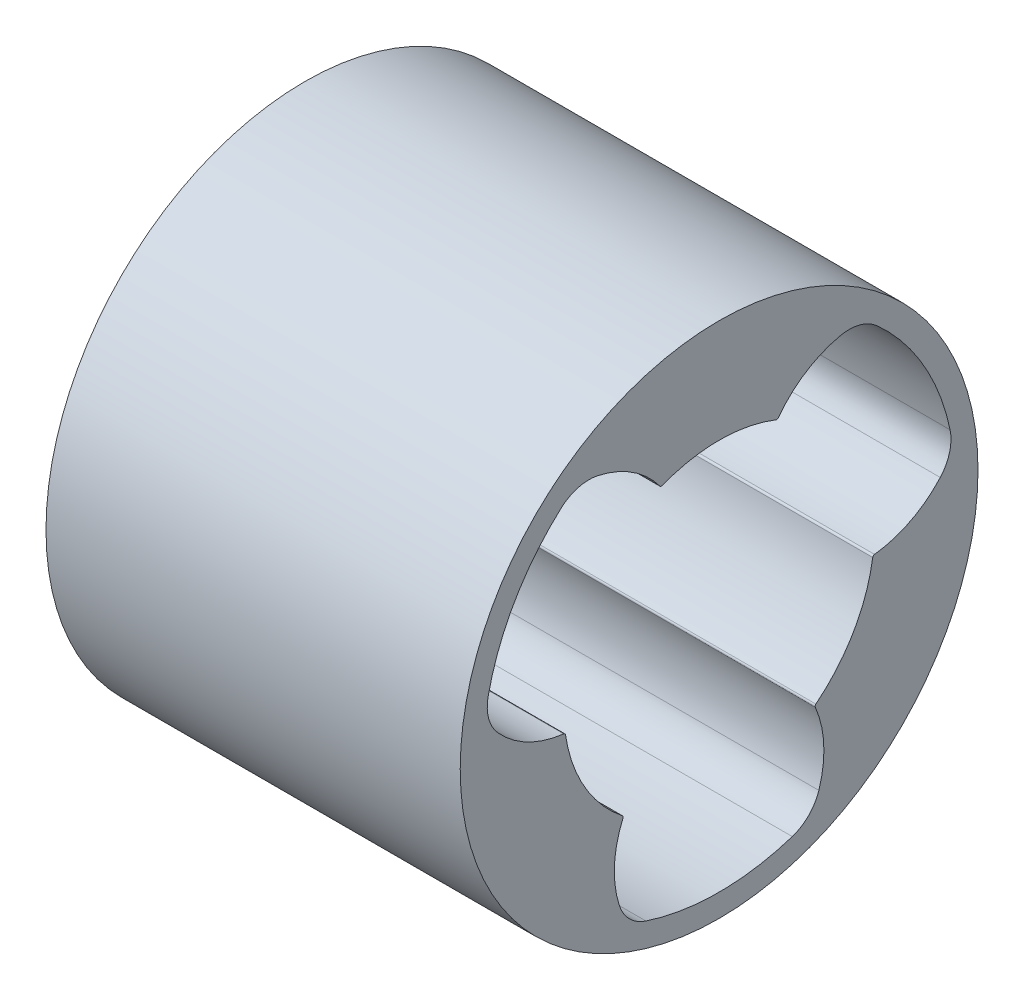
ISO-10303-21;
HEADER;
FILE_DESCRIPTION(('STEP AP214'),'2;1');
FILE_NAME('part.step','',(''),(''),'','','');
FILE_SCHEMA(('AUTOMOTIVE_DESIGN { 1 0 10303 214 1 1 1 1 }'));
ENDSEC;
DATA;
#1=APPLICATION_CONTEXT('core data for automotive mechanical design processes');
#2=APPLICATION_PROTOCOL_DEFINITION('international standard','automotive_design',2000,#1);
#3=PRODUCT_CONTEXT('',#1,'mechanical');
#4=PRODUCT('Part','Part','',(#3));
#5=PRODUCT_RELATED_PRODUCT_CATEGORY('part','',(#4));
#6=PRODUCT_DEFINITION_FORMATION('','',#4);
#7=PRODUCT_DEFINITION_CONTEXT('part definition',#1,'design');
#8=PRODUCT_DEFINITION('design','',#6,#7);
#9=PRODUCT_DEFINITION_SHAPE('','',#8);
#10=(LENGTH_UNIT() NAMED_UNIT(*) SI_UNIT(.MILLI.,.METRE.));
#11=(NAMED_UNIT(*) PLANE_ANGLE_UNIT() SI_UNIT($,.RADIAN.));
#12=(NAMED_UNIT(*) SI_UNIT($,.STERADIAN.) SOLID_ANGLE_UNIT());
#13=UNCERTAINTY_MEASURE_WITH_UNIT(LENGTH_MEASURE(1.E-05),#10,'distance_accuracy_value','');
#14=(GEOMETRIC_REPRESENTATION_CONTEXT(3) GLOBAL_UNCERTAINTY_ASSIGNED_CONTEXT((#13)) GLOBAL_UNIT_ASSIGNED_CONTEXT((#10,
#11,#12)) REPRESENTATION_CONTEXT('',''));
#15=CARTESIAN_POINT('',(0.,0.,0.));
#16=DIRECTION('',(0.,0.,1.));
#17=DIRECTION('',(1.,0.,0.));
#18=AXIS2_PLACEMENT_3D('',#15,#16,#17);
#19=CARTESIAN_POINT('',(7.62,10.16,17.5976362048998));
#20=DIRECTION('',(1.,0.,0.));
#21=DIRECTION('',(0.,0.,-1.));
#22=AXIS2_PLACEMENT_3D('',#19,#20,#21);
#23=CYLINDRICAL_SURFACE('',#22,12.8523999996979);
#24=CARTESIAN_POINT('',(7.62,10.16,17.5976362048998));
#25=DIRECTION('',(1.,0.,0.));
#26=DIRECTION('',(0.,0.,-1.));
#27=AXIS2_PLACEMENT_3D('',#24,#25,#26);
#28=CIRCLE('',#27,12.8523999996979);
#29=CARTESIAN_POINT('',(7.62,17.8124190998144,7.27171408273412));
#30=VERTEX_POINT('',#29);
#31=CARTESIAN_POINT('',(7.62,22.7238598368227,14.8895719972216));
#32=VERTEX_POINT('',#31);
#33=EDGE_CURVE('E245',#30,#32,#28,.T.);
#34=ORIENTED_EDGE('',*,*,#33,.F.);
#35=DIRECTION('',(1.,0.,0.));
#36=VECTOR('',#35,1.);
#37=CARTESIAN_POINT('',(7.62,17.8124190998144,7.27171408273412));
#38=LINE('',#37,#36);
#39=CARTESIAN_POINT('',(50.8,17.8124190998144,7.27171408273412));
#40=VERTEX_POINT('',#39);
#41=EDGE_CURVE('E337',#30,#40,#38,.T.);
#42=ORIENTED_EDGE('',*,*,#41,.T.);
#43=CARTESIAN_POINT('',(50.8,10.16,17.5976362048998));
#44=DIRECTION('',(1.,0.,0.));
#45=DIRECTION('',(0.,0.,-1.));
#46=AXIS2_PLACEMENT_3D('',#43,#44,#45);
#47=CIRCLE('',#46,12.8523999996979);
#48=CARTESIAN_POINT('',(50.8,22.7238598368227,14.8895719972216));
#49=VERTEX_POINT('',#48);
#50=EDGE_CURVE('E241',#40,#49,#47,.T.);
#51=ORIENTED_EDGE('',*,*,#50,.T.);
#52=DIRECTION('',(1.,0.,0.));
#53=VECTOR('',#52,1.);
#54=CARTESIAN_POINT('',(7.62,22.7238598368227,14.8895719972216));
#55=LINE('',#54,#53);
#56=EDGE_CURVE('E313',#49,#32,#55,.F.);
#57=ORIENTED_EDGE('',*,*,#56,.T.);
#58=EDGE_LOOP('',(#34,#42,#51,#57));
#59=FACE_BOUND('',#58,.T.);
#60=ADVANCED_FACE('F45',(#59),#23,.F.);
#61=CARTESIAN_POINT('',(7.62,-20.32,0.));
#62=DIRECTION('',(1.,0.,0.));
#63=DIRECTION('',(0.,0.,-1.));
#64=AXIS2_PLACEMENT_3D('',#61,#62,#63);
#65=CYLINDRICAL_SURFACE('',#64,12.8524);
#66=CARTESIAN_POINT('',(7.62,-20.32,0.));
#67=DIRECTION('',(1.,0.,0.));
#68=DIRECTION('',(0.,0.,-1.));
#69=AXIS2_PLACEMENT_3D('',#66,#67,#68);
#70=CIRCLE('',#69,12.8524);
#71=CARTESIAN_POINT('',(7.62,-15.2036986744186,11.7901504021727));
#72=VERTEX_POINT('',#71);
#73=CARTESIAN_POINT('',(7.62,-24.2566775196078,12.2346538923917));
#74=VERTEX_POINT('',#73);
#75=EDGE_CURVE('E564',#72,#74,#70,.T.);
#76=ORIENTED_EDGE('',*,*,#75,.F.);
#77=DIRECTION('',(1.,0.,0.));
#78=VECTOR('',#77,1.);
#79=CARTESIAN_POINT('',(7.62,-15.2036986744186,11.7901504021727));
#80=LINE('',#79,#78);
#81=CARTESIAN_POINT('',(50.8,-15.2036986744186,11.7901504021727));
#82=VERTEX_POINT('',#81);
#83=EDGE_CURVE('E387',#72,#82,#80,.T.);
#84=ORIENTED_EDGE('',*,*,#83,.T.);
#85=CARTESIAN_POINT('',(50.8,-20.32,0.));
#86=DIRECTION('',(1.,0.,0.));
#87=DIRECTION('',(0.,0.,-1.));
#88=AXIS2_PLACEMENT_3D('',#85,#86,#87);
#89=CIRCLE('',#88,12.8524);
#90=CARTESIAN_POINT('',(50.8,-24.2566775196078,12.2346538923917));
#91=VERTEX_POINT('',#90);
#92=EDGE_CURVE('E559',#82,#91,#89,.T.);
#93=ORIENTED_EDGE('',*,*,#92,.T.);
#94=DIRECTION('',(1.,0.,0.));
#95=VECTOR('',#94,1.);
#96=CARTESIAN_POINT('',(7.62,-24.2566775196078,12.2346538923917));
#97=LINE('',#96,#95);
#98=EDGE_CURVE('E292',#91,#74,#97,.F.);
#99=ORIENTED_EDGE('',*,*,#98,.T.);
#100=EDGE_LOOP('',(#76,#84,#93,#99));
#101=FACE_BOUND('',#100,.T.);
#102=ADVANCED_FACE('F454',(#101),#65,.F.);
#103=CARTESIAN_POINT('',(7.62,10.1600000003031,-17.597636204725));
#104=DIRECTION('',(1.,0.,0.));
#105=DIRECTION('',(0.,0.,-1.));
#106=AXIS2_PLACEMENT_3D('',#103,#104,#105);
#107=CYLINDRICAL_SURFACE('',#106,12.8523999996978);
#108=CARTESIAN_POINT('',(7.62,10.1600000003031,-17.597636204725));
#109=DIRECTION('',(1.,0.,0.));
#110=DIRECTION('',(0.,0.,-1.));
#111=AXIS2_PLACEMENT_3D('',#108,#109,#110);
#112=CIRCLE('',#111,12.8523999996978);
#113=CARTESIAN_POINT('',(7.62,-2.608720424874,-19.0618644847064));
#114=VERTEX_POINT('',#113);
#115=CARTESIAN_POINT('',(7.62,1.53281768342032,-27.1242258895754));
#116=VERTEX_POINT('',#115);
#117=EDGE_CURVE('E594',#114,#116,#112,.T.);
#118=ORIENTED_EDGE('',*,*,#117,.F.);
#119=DIRECTION('',(1.,0.,0.));
#120=VECTOR('',#119,1.);
#121=CARTESIAN_POINT('',(7.62,-2.60872042487401,-19.0618644847064));
#122=LINE('',#121,#120);
#123=CARTESIAN_POINT('',(50.8,-2.608720424874,-19.0618644847064));
#124=VERTEX_POINT('',#123);
#125=EDGE_CURVE('E379',#114,#124,#122,.T.);
#126=ORIENTED_EDGE('',*,*,#125,.T.);
#127=CARTESIAN_POINT('',(50.8,10.1600000003031,-17.597636204725));
#128=DIRECTION('',(1.,0.,0.));
#129=DIRECTION('',(0.,0.,-1.));
#130=AXIS2_PLACEMENT_3D('',#127,#128,#129);
#131=CIRCLE('',#130,12.8523999996978);
#132=CARTESIAN_POINT('',(50.8,1.53281768342032,-27.1242258895754));
#133=VERTEX_POINT('',#132);
#134=EDGE_CURVE('E589',#124,#133,#131,.T.);
#135=ORIENTED_EDGE('',*,*,#134,.T.);
#136=DIRECTION('',(1.,0.,0.));
#137=VECTOR('',#136,1.);
#138=CARTESIAN_POINT('',(7.62,1.53281768342032,-27.1242258895754));
#139=LINE('',#138,#137);
#140=EDGE_CURVE('E220',#133,#116,#139,.F.);
#141=ORIENTED_EDGE('',*,*,#140,.T.);
#142=EDGE_LOOP('',(#118,#126,#135,#141));
#143=FACE_BOUND('',#142,.T.);
#144=ADVANCED_FACE('F446',(#143),#107,.F.);
#145=CARTESIAN_POINT('',(50.8,0.,0.));
#146=DIRECTION('',(-1.,0.,0.));
#147=DIRECTION('',(0.,0.,1.));
#148=AXIS2_PLACEMENT_3D('',#145,#146,#147);
#149=CYLINDRICAL_SURFACE('',#148,31.75);
#150=CARTESIAN_POINT('',(50.8,0.,0.));
#151=DIRECTION('',(-1.,0.,0.));
#152=DIRECTION('',(0.,0.,1.));
#153=AXIS2_PLACEMENT_3D('',#150,#151,#152);
#154=CIRCLE('',#153,31.75);
#155=CARTESIAN_POINT('',(50.8,0.,31.75));
#156=VERTEX_POINT('',#155);
#157=EDGE_CURVE('E256',#156,#156,#154,.T.);
#158=ORIENTED_EDGE('',*,*,#157,.T.);
#159=EDGE_LOOP('',(#158));
#160=FACE_BOUND('',#159,.T.);
#161=CARTESIAN_POINT('',(0.,0.,0.));
#162=DIRECTION('',(-1.,0.,0.));
#163=DIRECTION('',(0.,0.,1.));
#164=AXIS2_PLACEMENT_3D('',#161,#162,#163);
#165=CIRCLE('',#164,31.75);
#166=CARTESIAN_POINT('',(0.,0.,31.75));
#167=VERTEX_POINT('',#166);
#168=EDGE_CURVE('E252',#167,#167,#165,.T.);
#169=ORIENTED_EDGE('',*,*,#168,.F.);
#170=EDGE_LOOP('',(#169));
#171=FACE_BOUND('',#170,.T.);
#172=ADVANCED_FACE('F444',(#160,#171),#149,.T.);
#173=CARTESIAN_POINT('',(50.8,31.75,0.));
#174=DIRECTION('',(1.,0.,0.));
#175=DIRECTION('',(0.,0.,-1.));
#176=AXIS2_PLACEMENT_3D('',#173,#174,#175);
#177=PLANE('',#176);
#178=ORIENTED_EDGE('',*,*,#50,.F.);
#179=CARTESIAN_POINT('',(50.8,17.9636526788657,7.0676444755719));
#180=DIRECTION('',(1.,0.,0.));
#181=DIRECTION('',(0.,0.,-1.));
#182=AXIS2_PLACEMENT_3D('',#179,#180,#181);
#183=CIRCLE('',#182,0.254000000000001);
#184=CARTESIAN_POINT('',(50.8,17.727288827828,6.9746491535249));
#185=VERTEX_POINT('',#184);
#186=EDGE_CURVE('E355',#40,#185,#183,.T.);
#187=ORIENTED_EDGE('',*,*,#186,.T.);
#188=CARTESIAN_POINT('',(50.8,0.,0.));
#189=DIRECTION('',(-1.,0.,0.));
#190=DIRECTION('',(0.,0.,1.));
#191=AXIS2_PLACEMENT_3D('',#188,#189,#190);
#192=CIRCLE('',#191,19.05);
#193=CARTESIAN_POINT('',(50.8,17.727288827948,-6.97464915321979));
#194=VERTEX_POINT('',#193);
#195=EDGE_CURVE('E423',#185,#194,#192,.T.);
#196=ORIENTED_EDGE('',*,*,#195,.T.);
#197=CARTESIAN_POINT('',(50.8,17.9636526789873,-7.06764447526272));
#198=DIRECTION('',(1.,0.,0.));
#199=DIRECTION('',(0.,0.,-1.));
#200=AXIS2_PLACEMENT_3D('',#197,#198,#199);
#201=CIRCLE('',#200,0.254000000000001);
#202=CARTESIAN_POINT('',(50.8,17.8124190999396,-7.27171408242754));
#203=VERTEX_POINT('',#202);
#204=EDGE_CURVE('E349',#194,#203,#201,.T.);
#205=ORIENTED_EDGE('',*,*,#204,.T.);
#206=CARTESIAN_POINT('',(50.8,22.7238598371625,-14.8895719972171));
#207=VERTEX_POINT('',#206);
#208=EDGE_CURVE('E583',#207,#203,#131,.T.);
#209=ORIENTED_EDGE('',*,*,#208,.F.);
#210=CARTESIAN_POINT('',(50.8,17.7579073323582,-15.9599531069292));
#211=DIRECTION('',(1.,0.,0.));
#212=DIRECTION('',(0.,0.,-1.));
#213=AXIS2_PLACEMENT_3D('',#210,#211,#212);
#214=CIRCLE('',#213,5.08);
#215=CARTESIAN_POINT('',(50.8,21.5361854881791,-19.3556878105312));
#216=VERTEX_POINT('',#215);
#217=EDGE_CURVE('E326',#207,#216,#214,.F.);
#218=ORIENTED_EDGE('',*,*,#217,.T.);
#219=CARTESIAN_POINT('',(50.8,0.,0.));
#220=DIRECTION('',(1.,0.,0.));
#221=DIRECTION('',(0.,0.,-1.));
#222=AXIS2_PLACEMENT_3D('',#219,#220,#221);
#223=CIRCLE('',#222,28.956);
#224=CARTESIAN_POINT('',(50.8,5.99442460852682,-28.328727638436));
#225=VERTEX_POINT('',#224);
#226=EDGE_CURVE('E588',#225,#216,#223,.T.);
#227=ORIENTED_EDGE('',*,*,#226,.F.);
#228=CARTESIAN_POINT('',(50.8,4.9427711684344,-23.3587754211665));
#229=DIRECTION('',(1.,0.,0.));
#230=DIRECTION('',(0.,0.,-1.));
#231=AXIS2_PLACEMENT_3D('',#228,#229,#230);
#232=CIRCLE('',#231,5.08);
#233=EDGE_CURVE('E333',#225,#133,#232,.F.);
#234=ORIENTED_EDGE('',*,*,#233,.T.);
#235=ORIENTED_EDGE('',*,*,#134,.F.);
#236=CARTESIAN_POINT('',(50.8,-2.86106667834194,-19.0908018024933));
#237=DIRECTION('',(1.,0.,0.));
#238=DIRECTION('',(0.,0.,-1.));
#239=AXIS2_PLACEMENT_3D('',#236,#237,#238);
#240=CIRCLE('',#239,0.254000000000001);
#241=CARTESIAN_POINT('',(50.8,-2.82342106415323,-18.8396070419342));
#242=VERTEX_POINT('',#241);
#243=EDGE_CURVE('E352',#124,#242,#240,.T.);
#244=ORIENTED_EDGE('',*,*,#243,.T.);
#245=CARTESIAN_POINT('',(50.8,0.,0.));
#246=DIRECTION('',(1.,0.,0.));
#247=DIRECTION('',(0.,0.,-1.));
#248=AXIS2_PLACEMENT_3D('',#245,#246,#247);
#249=CIRCLE('',#248,19.05);
#250=CARTESIAN_POINT('',(50.8,-14.9038677631579,-11.8649578886022));
#251=VERTEX_POINT('',#250);
#252=EDGE_CURVE('E231',#251,#242,#249,.T.);
#253=ORIENTED_EDGE('',*,*,#252,.F.);
#254=CARTESIAN_POINT('',(50.8,-15.102586,-12.0231573271169));
#255=DIRECTION('',(1.,0.,0.));
#256=DIRECTION('',(0.,0.,-1.));
#257=AXIS2_PLACEMENT_3D('',#254,#255,#256);
#258=CIRCLE('',#257,0.254000000000001);
#259=CARTESIAN_POINT('',(50.8,-15.2036986744186,-11.7901504021727));
#260=VERTEX_POINT('',#259);
#261=EDGE_CURVE('E341',#251,#260,#258,.T.);
#262=ORIENTED_EDGE('',*,*,#261,.T.);
#263=CARTESIAN_POINT('',(50.8,-24.2566775196078,-12.2346538923917));
#264=VERTEX_POINT('',#263);
#265=EDGE_CURVE('E553',#264,#260,#89,.T.);
#266=ORIENTED_EDGE('',*,*,#265,.F.);
#267=CARTESIAN_POINT('',(50.8,-22.7006785,-7.39882231437124));
#268=DIRECTION('',(1.,0.,0.));
#269=DIRECTION('',(0.,0.,-1.));
#270=AXIS2_PLACEMENT_3D('',#267,#268,#269);
#271=CIRCLE('',#270,5.08);
#272=CARTESIAN_POINT('',(50.8,-27.5306100957447,-8.97303982806725));
#273=VERTEX_POINT('',#272);
#274=EDGE_CURVE('E219',#264,#273,#271,.F.);
#275=ORIENTED_EDGE('',*,*,#274,.T.);
#276=CARTESIAN_POINT('',(50.8,-1.01518793371724E-13,0.));
#277=DIRECTION('',(1.,0.,0.));
#278=DIRECTION('',(0.,0.,-1.));
#279=AXIS2_PLACEMENT_3D('',#276,#277,#278);
#280=CIRCLE('',#279,28.9559999999999);
#281=CARTESIAN_POINT('',(50.8,-27.5306100957447,8.97303982806725));
#282=VERTEX_POINT('',#281);
#283=EDGE_CURVE('E558',#282,#273,#280,.T.);
#284=ORIENTED_EDGE('',*,*,#283,.F.);
#285=CARTESIAN_POINT('',(50.8,-22.7006785,7.39882231437124));
#286=DIRECTION('',(1.,0.,0.));
#287=DIRECTION('',(0.,0.,-1.));
#288=AXIS2_PLACEMENT_3D('',#285,#286,#287);
#289=CIRCLE('',#288,5.08);
#290=EDGE_CURVE('E322',#282,#91,#289,.F.);
#291=ORIENTED_EDGE('',*,*,#290,.T.);
#292=ORIENTED_EDGE('',*,*,#92,.F.);
#293=CARTESIAN_POINT('',(50.8,-15.102586,12.0231573271169));
#294=DIRECTION('',(1.,0.,0.));
#295=DIRECTION('',(0.,0.,-1.));
#296=AXIS2_PLACEMENT_3D('',#293,#294,#295);
#297=CIRCLE('',#296,0.254000000000001);
#298=CARTESIAN_POINT('',(50.8,-14.9038677631579,11.8649578886022));
#299=VERTEX_POINT('',#298);
#300=EDGE_CURVE('E346',#82,#299,#297,.T.);
#301=ORIENTED_EDGE('',*,*,#300,.T.);
#302=CARTESIAN_POINT('',(50.8,-2.82342106447779,18.8396070418855));
#303=VERTEX_POINT('',#302);
#304=EDGE_CURVE('E260',#299,#303,#192,.T.);
#305=ORIENTED_EDGE('',*,*,#304,.T.);
#306=CARTESIAN_POINT('',(50.8,-2.86106667867083,19.090801802444));
#307=DIRECTION('',(1.,0.,0.));
#308=DIRECTION('',(0.,0.,-1.));
#309=AXIS2_PLACEMENT_3D('',#306,#307,#308);
#310=CIRCLE('',#309,0.254000000000001);
#311=CARTESIAN_POINT('',(50.8,-2.6087204252024,19.0618644846615));
#312=VERTEX_POINT('',#311);
#313=EDGE_CURVE('E238',#303,#312,#310,.T.);
#314=ORIENTED_EDGE('',*,*,#313,.T.);
#315=CARTESIAN_POINT('',(50.8,1.53281768324661,27.1242258898675));
#316=VERTEX_POINT('',#315);
#317=EDGE_CURVE('E226',#316,#312,#47,.T.);
#318=ORIENTED_EDGE('',*,*,#317,.F.);
#319=CARTESIAN_POINT('',(50.8,4.94277116820953,23.3587754214123));
#320=DIRECTION('',(1.,0.,0.));
#321=DIRECTION('',(0.,0.,-1.));
#322=AXIS2_PLACEMENT_3D('',#319,#320,#321);
#323=CIRCLE('',#322,5.08);
#324=CARTESIAN_POINT('',(50.8,5.99442460836939,28.3287276386675));
#325=VERTEX_POINT('',#324);
#326=EDGE_CURVE('E208',#316,#325,#323,.F.);
#327=ORIENTED_EDGE('',*,*,#326,.T.);
#328=CARTESIAN_POINT('',(50.8,-5.41826999933548E-10,3.12860848339369E-10));
#329=DIRECTION('',(1.,0.,0.));
#330=DIRECTION('',(0.,0.,-1.));
#331=AXIS2_PLACEMENT_3D('',#328,#329,#330);
#332=CIRCLE('',#331,28.956);
#333=CARTESIAN_POINT('',(50.8,21.5361854879,19.3556878105517));
#334=VERTEX_POINT('',#333);
#335=EDGE_CURVE('E240',#334,#325,#332,.T.);
#336=ORIENTED_EDGE('',*,*,#335,.F.);
#337=CARTESIAN_POINT('',(50.8,17.757907332033,15.959953107001));
#338=DIRECTION('',(1.,0.,0.));
#339=DIRECTION('',(0.,0.,-1.));
#340=AXIS2_PLACEMENT_3D('',#337,#338,#339);
#341=CIRCLE('',#340,5.08);
#342=EDGE_CURVE('E329',#334,#49,#341,.F.);
#343=ORIENTED_EDGE('',*,*,#342,.T.);
#344=EDGE_LOOP('',(#178,#187,#196,#205,#209,#218,#227,#234,#235,#244,#253,#262,#266,#275,#284,
#291,#292,#301,#305,#314,#318,#327,#336,#343));
#345=FACE_BOUND('',#344,.T.);
#346=ORIENTED_EDGE('',*,*,#157,.F.);
#347=EDGE_LOOP('',(#346));
#348=FACE_BOUND('',#347,.T.);
#349=ADVANCED_FACE('F234',(#345,#348),#177,.T.);
#350=CARTESIAN_POINT('',(0.,0.,0.));
#351=DIRECTION('',(-1.,0.,0.));
#352=DIRECTION('',(0.,0.,1.));
#353=AXIS2_PLACEMENT_3D('',#350,#351,#352);
#354=PLANE('',#353);
#355=CARTESIAN_POINT('',(0.,0.,0.));
#356=DIRECTION('',(-1.,0.,0.));
#357=DIRECTION('',(0.,0.,1.));
#358=AXIS2_PLACEMENT_3D('',#355,#356,#357);
#359=CIRCLE('',#358,19.05);
#360=CARTESIAN_POINT('',(0.,0.,19.05));
#361=VERTEX_POINT('',#360);
#362=EDGE_CURVE('E429',#361,#361,#359,.T.);
#363=ORIENTED_EDGE('',*,*,#362,.F.);
#364=EDGE_LOOP('',(#363));
#365=FACE_BOUND('',#364,.T.);
#366=ORIENTED_EDGE('',*,*,#168,.T.);
#367=EDGE_LOOP('',(#366));
#368=FACE_BOUND('',#367,.T.);
#369=ADVANCED_FACE('F438',(#365,#368),#354,.T.);
#370=ORIENTED_EDGE('',*,*,#317,.T.);
#371=DIRECTION('',(1.,0.,0.));
#372=VECTOR('',#371,1.);
#373=CARTESIAN_POINT('',(7.62,-2.6087204252024,19.0618644846615));
#374=LINE('',#373,#372);
#375=CARTESIAN_POINT('',(7.62,-2.6087204252024,19.0618644846615));
#376=VERTEX_POINT('',#375);
#377=EDGE_CURVE('E391',#312,#376,#374,.F.);
#378=ORIENTED_EDGE('',*,*,#377,.T.);
#379=CARTESIAN_POINT('',(7.62,1.53281768324661,27.1242258898675));
#380=VERTEX_POINT('',#379);
#381=EDGE_CURVE('E228',#380,#376,#28,.T.);
#382=ORIENTED_EDGE('',*,*,#381,.F.);
#383=DIRECTION('',(1.,0.,0.));
#384=VECTOR('',#383,1.);
#385=CARTESIAN_POINT('',(7.62,1.53281768324661,27.1242258898675));
#386=LINE('',#385,#384);
#387=EDGE_CURVE('E212',#380,#316,#386,.T.);
#388=ORIENTED_EDGE('',*,*,#387,.T.);
#389=EDGE_LOOP('',(#370,#378,#382,#388));
#390=FACE_BOUND('',#389,.T.);
#391=ADVANCED_FACE('F225',(#390),#23,.F.);
#392=CARTESIAN_POINT('',(7.62,-5.41826999933548E-10,3.12860848339369E-10));
#393=DIRECTION('',(1.,0.,0.));
#394=DIRECTION('',(0.,0.,-1.));
#395=AXIS2_PLACEMENT_3D('',#392,#393,#394);
#396=CYLINDRICAL_SURFACE('',#395,28.956);
#397=ORIENTED_EDGE('',*,*,#335,.T.);
#398=DIRECTION('',(1.,0.,0.));
#399=VECTOR('',#398,1.);
#400=CARTESIAN_POINT('',(7.62,5.99442460836939,28.3287276386675));
#401=LINE('',#400,#399);
#402=CARTESIAN_POINT('',(7.62,5.99442460836939,28.3287276386675));
#403=VERTEX_POINT('',#402);
#404=EDGE_CURVE('E213',#325,#403,#401,.F.);
#405=ORIENTED_EDGE('',*,*,#404,.T.);
#406=CARTESIAN_POINT('',(7.62,-5.41826999933548E-10,3.12860848339369E-10));
#407=DIRECTION('',(1.,0.,0.));
#408=DIRECTION('',(0.,0.,-1.));
#409=AXIS2_PLACEMENT_3D('',#406,#407,#408);
#410=CIRCLE('',#409,28.956);
#411=CARTESIAN_POINT('',(7.62,21.5361854879,19.3556878105517));
#412=VERTEX_POINT('',#411);
#413=EDGE_CURVE('E249',#412,#403,#410,.T.);
#414=ORIENTED_EDGE('',*,*,#413,.F.);
#415=DIRECTION('',(1.,0.,0.));
#416=VECTOR('',#415,1.);
#417=CARTESIAN_POINT('',(7.62,21.5361854879,19.3556878105517));
#418=LINE('',#417,#416);
#419=EDGE_CURVE('E230',#412,#334,#418,.T.);
#420=ORIENTED_EDGE('',*,*,#419,.T.);
#421=EDGE_LOOP('',(#397,#405,#414,#420));
#422=FACE_BOUND('',#421,.T.);
#423=ADVANCED_FACE('F472',(#422),#396,.F.);
#424=CARTESIAN_POINT('',(7.62,5.07999999972909,8.79881810260633));
#425=DIRECTION('',(1.,0.,0.));
#426=DIRECTION('',(0.,0.,-1.));
#427=AXIS2_PLACEMENT_3D('',#424,#425,#426);
#428=PLANE('',#427);
#429=ORIENTED_EDGE('',*,*,#413,.T.);
#430=CARTESIAN_POINT('',(7.62,4.94277116820953,23.3587754214123));
#431=DIRECTION('',(1.,0.,0.));
#432=DIRECTION('',(0.,0.,-1.));
#433=AXIS2_PLACEMENT_3D('',#430,#431,#432);
#434=CIRCLE('',#433,5.08);
#435=EDGE_CURVE('E272',#403,#380,#434,.T.);
#436=ORIENTED_EDGE('',*,*,#435,.T.);
#437=ORIENTED_EDGE('',*,*,#381,.T.);
#438=CARTESIAN_POINT('',(7.62,-2.86106667867083,19.090801802444));
#439=DIRECTION('',(1.,0.,0.));
#440=DIRECTION('',(0.,0.,-1.));
#441=AXIS2_PLACEMENT_3D('',#438,#439,#440);
#442=CIRCLE('',#441,0.254000000000001);
#443=CARTESIAN_POINT('',(7.62,-2.82342106447779,18.8396070418855));
#444=VERTEX_POINT('',#443);
#445=EDGE_CURVE('E54',#376,#444,#442,.F.);
#446=ORIENTED_EDGE('',*,*,#445,.T.);
#447=CARTESIAN_POINT('',(7.62,0.,0.));
#448=DIRECTION('',(1.,0.,0.));
#449=DIRECTION('',(0.,0.,-1.));
#450=AXIS2_PLACEMENT_3D('',#447,#448,#449);
#451=CIRCLE('',#450,19.05);
#452=CARTESIAN_POINT('',(7.62,17.727288827828,6.9746491535249));
#453=VERTEX_POINT('',#452);
#454=EDGE_CURVE('E413',#453,#444,#451,.T.);
#455=ORIENTED_EDGE('',*,*,#454,.F.);
#456=CARTESIAN_POINT('',(7.62,17.9636526788657,7.0676444755719));
#457=DIRECTION('',(1.,0.,0.));
#458=DIRECTION('',(0.,0.,-1.));
#459=AXIS2_PLACEMENT_3D('',#456,#457,#458);
#460=CIRCLE('',#459,0.254000000000001);
#461=EDGE_CURVE('E397',#453,#30,#460,.F.);
#462=ORIENTED_EDGE('',*,*,#461,.T.);
#463=ORIENTED_EDGE('',*,*,#33,.T.);
#464=CARTESIAN_POINT('',(7.62,17.757907332033,15.959953107001));
#465=DIRECTION('',(1.,0.,0.));
#466=DIRECTION('',(0.,0.,-1.));
#467=AXIS2_PLACEMENT_3D('',#464,#465,#466);
#468=CIRCLE('',#467,5.08);
#469=EDGE_CURVE('E269',#32,#412,#468,.T.);
#470=ORIENTED_EDGE('',*,*,#469,.T.);
#471=EDGE_LOOP('',(#429,#436,#437,#446,#455,#462,#463,#470));
#472=FACE_BOUND('',#471,.T.);
#473=ADVANCED_FACE('F412',(#472),#428,.T.);
#474=ORIENTED_EDGE('',*,*,#265,.T.);
#475=DIRECTION('',(1.,0.,0.));
#476=VECTOR('',#475,1.);
#477=CARTESIAN_POINT('',(7.62,-15.2036986744186,-11.7901504021727));
#478=LINE('',#477,#476);
#479=CARTESIAN_POINT('',(7.62,-15.2036986744186,-11.7901504021727));
#480=VERTEX_POINT('',#479);
#481=EDGE_CURVE('E394',#260,#480,#478,.F.);
#482=ORIENTED_EDGE('',*,*,#481,.T.);
#483=CARTESIAN_POINT('',(7.62,-24.2566775196078,-12.2346538923917));
#484=VERTEX_POINT('',#483);
#485=EDGE_CURVE('E598',#484,#480,#70,.T.);
#486=ORIENTED_EDGE('',*,*,#485,.F.);
#487=DIRECTION('',(1.,0.,0.));
#488=VECTOR('',#487,1.);
#489=CARTESIAN_POINT('',(7.62,-24.2566775196078,-12.2346538923917));
#490=LINE('',#489,#488);
#491=EDGE_CURVE('E275',#484,#264,#490,.T.);
#492=ORIENTED_EDGE('',*,*,#491,.T.);
#493=EDGE_LOOP('',(#474,#482,#486,#492));
#494=FACE_BOUND('',#493,.T.);
#495=ADVANCED_FACE('F468',(#494),#65,.F.);
#496=CARTESIAN_POINT('',(7.62,-1.01518793371724E-13,0.));
#497=DIRECTION('',(1.,0.,0.));
#498=DIRECTION('',(0.,0.,-1.));
#499=AXIS2_PLACEMENT_3D('',#496,#497,#498);
#500=CYLINDRICAL_SURFACE('',#499,28.9559999999999);
#501=ORIENTED_EDGE('',*,*,#283,.T.);
#502=DIRECTION('',(1.,0.,0.));
#503=VECTOR('',#502,1.);
#504=CARTESIAN_POINT('',(7.62,-27.5306100957447,-8.97303982806725));
#505=LINE('',#504,#503);
#506=CARTESIAN_POINT('',(7.62,-27.5306100957447,-8.97303982806725));
#507=VERTEX_POINT('',#506);
#508=EDGE_CURVE('E283',#273,#507,#505,.F.);
#509=ORIENTED_EDGE('',*,*,#508,.T.);
#510=CARTESIAN_POINT('',(7.62,-1.01518793371724E-13,0.));
#511=DIRECTION('',(1.,0.,0.));
#512=DIRECTION('',(0.,0.,-1.));
#513=AXIS2_PLACEMENT_3D('',#510,#511,#512);
#514=CIRCLE('',#513,28.9559999999999);
#515=CARTESIAN_POINT('',(7.62,-27.5306100957447,8.97303982806725));
#516=VERTEX_POINT('',#515);
#517=EDGE_CURVE('E247',#516,#507,#514,.T.);
#518=ORIENTED_EDGE('',*,*,#517,.F.);
#519=DIRECTION('',(1.,0.,0.));
#520=VECTOR('',#519,1.);
#521=CARTESIAN_POINT('',(7.62,-27.5306100957447,8.97303982806725));
#522=LINE('',#521,#520);
#523=EDGE_CURVE('E279',#516,#282,#522,.T.);
#524=ORIENTED_EDGE('',*,*,#523,.T.);
#525=EDGE_LOOP('',(#501,#509,#518,#524));
#526=FACE_BOUND('',#525,.T.);
#527=ADVANCED_FACE('F484',(#526),#500,.F.);
#528=CARTESIAN_POINT('',(7.62,-10.1600000000001,0.));
#529=DIRECTION('',(1.,0.,0.));
#530=DIRECTION('',(0.,0.,-1.));
#531=AXIS2_PLACEMENT_3D('',#528,#529,#530);
#532=PLANE('',#531);
#533=ORIENTED_EDGE('',*,*,#517,.T.);
#534=CARTESIAN_POINT('',(7.62,-22.7006785,-7.39882231437124));
#535=DIRECTION('',(1.,0.,0.));
#536=DIRECTION('',(0.,0.,-1.));
#537=AXIS2_PLACEMENT_3D('',#534,#535,#536);
#538=CIRCLE('',#537,5.08);
#539=EDGE_CURVE('E289',#507,#484,#538,.T.);
#540=ORIENTED_EDGE('',*,*,#539,.T.);
#541=ORIENTED_EDGE('',*,*,#485,.T.);
#542=CARTESIAN_POINT('',(7.62,-15.102586,-12.0231573271169));
#543=DIRECTION('',(1.,0.,0.));
#544=DIRECTION('',(0.,0.,-1.));
#545=AXIS2_PLACEMENT_3D('',#542,#543,#544);
#546=CIRCLE('',#545,0.254000000000001);
#547=CARTESIAN_POINT('',(7.62,-14.9038677631579,-11.8649578886022));
#548=VERTEX_POINT('',#547);
#549=EDGE_CURVE('E11',#480,#548,#546,.F.);
#550=ORIENTED_EDGE('',*,*,#549,.T.);
#551=CARTESIAN_POINT('',(7.62,0.,0.));
#552=DIRECTION('',(1.,0.,0.));
#553=DIRECTION('',(0.,0.,-1.));
#554=AXIS2_PLACEMENT_3D('',#551,#552,#553);
#555=CIRCLE('',#554,19.05);
#556=CARTESIAN_POINT('',(7.62,-14.9038677631579,11.8649578886022));
#557=VERTEX_POINT('',#556);
#558=EDGE_CURVE('E433',#557,#548,#555,.T.);
#559=ORIENTED_EDGE('',*,*,#558,.F.);
#560=CARTESIAN_POINT('',(7.62,-15.102586,12.0231573271169));
#561=DIRECTION('',(1.,0.,0.));
#562=DIRECTION('',(0.,0.,-1.));
#563=AXIS2_PLACEMENT_3D('',#560,#561,#562);
#564=CIRCLE('',#563,0.254000000000001);
#565=EDGE_CURVE('E407',#557,#72,#564,.F.);
#566=ORIENTED_EDGE('',*,*,#565,.T.);
#567=ORIENTED_EDGE('',*,*,#75,.T.);
#568=CARTESIAN_POINT('',(7.62,-22.7006785,7.39882231437124));
#569=DIRECTION('',(1.,0.,0.));
#570=DIRECTION('',(0.,0.,-1.));
#571=AXIS2_PLACEMENT_3D('',#568,#569,#570);
#572=CIRCLE('',#571,5.08);
#573=EDGE_CURVE('E286',#74,#516,#572,.T.);
#574=ORIENTED_EDGE('',*,*,#573,.T.);
#575=EDGE_LOOP('',(#533,#540,#541,#550,#559,#566,#567,#574));
#576=FACE_BOUND('',#575,.T.);
#577=ADVANCED_FACE('F487',(#576),#532,.T.);
#578=ORIENTED_EDGE('',*,*,#208,.T.);
#579=DIRECTION('',(1.,0.,0.));
#580=VECTOR('',#579,1.);
#581=CARTESIAN_POINT('',(7.62,17.8124190999396,-7.27171408242754));
#582=LINE('',#581,#580);
#583=CARTESIAN_POINT('',(7.62,17.8124190999396,-7.27171408242754));
#584=VERTEX_POINT('',#583);
#585=EDGE_CURVE('E383',#203,#584,#582,.F.);
#586=ORIENTED_EDGE('',*,*,#585,.T.);
#587=CARTESIAN_POINT('',(7.62,22.7238598371625,-14.8895719972171));
#588=VERTEX_POINT('',#587);
#589=EDGE_CURVE('E617',#588,#584,#112,.T.);
#590=ORIENTED_EDGE('',*,*,#589,.F.);
#591=DIRECTION('',(1.,0.,0.));
#592=VECTOR('',#591,1.);
#593=CARTESIAN_POINT('',(7.62,22.7238598371625,-14.8895719972171));
#594=LINE('',#593,#592);
#595=EDGE_CURVE('E296',#588,#207,#594,.T.);
#596=ORIENTED_EDGE('',*,*,#595,.T.);
#597=EDGE_LOOP('',(#578,#586,#590,#596));
#598=FACE_BOUND('',#597,.T.);
#599=ADVANCED_FACE('F457',(#598),#107,.F.);
#600=CARTESIAN_POINT('',(7.62,0.,0.));
#601=DIRECTION('',(1.,0.,0.));
#602=DIRECTION('',(0.,0.,-1.));
#603=AXIS2_PLACEMENT_3D('',#600,#601,#602);
#604=CYLINDRICAL_SURFACE('',#603,28.956);
#605=ORIENTED_EDGE('',*,*,#226,.T.);
#606=DIRECTION('',(1.,0.,0.));
#607=VECTOR('',#606,1.);
#608=CARTESIAN_POINT('',(7.62,21.5361854881791,-19.3556878105312));
#609=LINE('',#608,#607);
#610=CARTESIAN_POINT('',(7.62,21.5361854881791,-19.3556878105312));
#611=VERTEX_POINT('',#610);
#612=EDGE_CURVE('E304',#216,#611,#609,.F.);
#613=ORIENTED_EDGE('',*,*,#612,.T.);
#614=CARTESIAN_POINT('',(7.62,0.,0.));
#615=DIRECTION('',(1.,0.,0.));
#616=DIRECTION('',(0.,0.,-1.));
#617=AXIS2_PLACEMENT_3D('',#614,#615,#616);
#618=CIRCLE('',#617,28.956);
#619=CARTESIAN_POINT('',(7.62,5.99442460852682,-28.328727638436));
#620=VERTEX_POINT('',#619);
#621=EDGE_CURVE('E566',#620,#611,#618,.T.);
#622=ORIENTED_EDGE('',*,*,#621,.F.);
#623=DIRECTION('',(1.,0.,0.));
#624=VECTOR('',#623,1.);
#625=CARTESIAN_POINT('',(7.62,5.99442460852682,-28.328727638436));
#626=LINE('',#625,#624);
#627=EDGE_CURVE('E300',#620,#225,#626,.T.);
#628=ORIENTED_EDGE('',*,*,#627,.T.);
#629=EDGE_LOOP('',(#605,#613,#622,#628));
#630=FACE_BOUND('',#629,.T.);
#631=ADVANCED_FACE('F493',(#630),#604,.F.);
#632=CARTESIAN_POINT('',(7.62,5.08000000015157,-8.79881810236249));
#633=DIRECTION('',(1.,0.,0.));
#634=DIRECTION('',(0.,0.,-1.));
#635=AXIS2_PLACEMENT_3D('',#632,#633,#634);
#636=PLANE('',#635);
#637=ORIENTED_EDGE('',*,*,#621,.T.);
#638=CARTESIAN_POINT('',(7.62,17.7579073323582,-15.9599531069292));
#639=DIRECTION('',(1.,0.,0.));
#640=DIRECTION('',(0.,0.,-1.));
#641=AXIS2_PLACEMENT_3D('',#638,#639,#640);
#642=CIRCLE('',#641,5.08);
#643=EDGE_CURVE('E310',#611,#588,#642,.T.);
#644=ORIENTED_EDGE('',*,*,#643,.T.);
#645=ORIENTED_EDGE('',*,*,#589,.T.);
#646=CARTESIAN_POINT('',(7.62,17.9636526789873,-7.06764447526272));
#647=DIRECTION('',(1.,0.,0.));
#648=DIRECTION('',(0.,0.,-1.));
#649=AXIS2_PLACEMENT_3D('',#646,#647,#648);
#650=CIRCLE('',#649,0.254000000000001);
#651=CARTESIAN_POINT('',(7.62,17.727288827948,-6.97464915321979));
#652=VERTEX_POINT('',#651);
#653=EDGE_CURVE('E403',#584,#652,#650,.F.);
#654=ORIENTED_EDGE('',*,*,#653,.T.);
#655=CARTESIAN_POINT('',(7.62,0.,0.));
#656=DIRECTION('',(1.,0.,0.));
#657=DIRECTION('',(0.,0.,-1.));
#658=AXIS2_PLACEMENT_3D('',#655,#656,#657);
#659=CIRCLE('',#658,19.05);
#660=CARTESIAN_POINT('',(7.62,-2.82342106415323,-18.8396070419342));
#661=VERTEX_POINT('',#660);
#662=EDGE_CURVE('E428',#661,#652,#659,.T.);
#663=ORIENTED_EDGE('',*,*,#662,.F.);
#664=CARTESIAN_POINT('',(7.62,-2.86106667834194,-19.0908018024933));
#665=DIRECTION('',(1.,0.,0.));
#666=DIRECTION('',(0.,0.,-1.));
#667=AXIS2_PLACEMENT_3D('',#664,#665,#666);
#668=CIRCLE('',#667,0.254000000000001);
#669=EDGE_CURVE('E400',#661,#114,#668,.F.);
#670=ORIENTED_EDGE('',*,*,#669,.T.);
#671=ORIENTED_EDGE('',*,*,#117,.T.);
#672=CARTESIAN_POINT('',(7.62,4.9427711684344,-23.3587754211665));
#673=DIRECTION('',(1.,0.,0.));
#674=DIRECTION('',(0.,0.,-1.));
#675=AXIS2_PLACEMENT_3D('',#672,#673,#674);
#676=CIRCLE('',#675,5.08);
#677=EDGE_CURVE('E307',#116,#620,#676,.T.);
#678=ORIENTED_EDGE('',*,*,#677,.T.);
#679=EDGE_LOOP('',(#637,#644,#645,#654,#663,#670,#671,#678));
#680=FACE_BOUND('',#679,.T.);
#681=ADVANCED_FACE('F497',(#680),#636,.T.);
#682=CARTESIAN_POINT('',(0.,0.,0.));
#683=DIRECTION('',(-1.,0.,0.));
#684=DIRECTION('',(0.,0.,1.));
#685=AXIS2_PLACEMENT_3D('',#682,#683,#684);
#686=CYLINDRICAL_SURFACE('',#685,19.05);
#687=ORIENTED_EDGE('',*,*,#362,.T.);
#688=EDGE_LOOP('',(#687));
#689=FACE_BOUND('',#688,.T.);
#690=ORIENTED_EDGE('',*,*,#195,.F.);
#691=DIRECTION('',(-1.,0.,0.));
#692=VECTOR('',#691,1.);
#693=CARTESIAN_POINT('',(0.,17.727288827828,6.9746491535249));
#694=LINE('',#693,#692);
#695=EDGE_CURVE('E375',#185,#453,#694,.T.);
#696=ORIENTED_EDGE('',*,*,#695,.T.);
#697=ORIENTED_EDGE('',*,*,#454,.T.);
#698=DIRECTION('',(-1.,0.,0.));
#699=VECTOR('',#698,1.);
#700=CARTESIAN_POINT('',(0.,-2.82342106447779,18.8396070418855));
#701=LINE('',#700,#699);
#702=EDGE_CURVE('E361',#444,#303,#701,.F.);
#703=ORIENTED_EDGE('',*,*,#702,.T.);
#704=ORIENTED_EDGE('',*,*,#304,.F.);
#705=DIRECTION('',(-1.,0.,0.));
#706=VECTOR('',#705,1.);
#707=CARTESIAN_POINT('',(0.,-14.9038677631579,11.8649578886022));
#708=LINE('',#707,#706);
#709=EDGE_CURVE('E364',#299,#557,#708,.T.);
#710=ORIENTED_EDGE('',*,*,#709,.T.);
#711=ORIENTED_EDGE('',*,*,#558,.T.);
#712=DIRECTION('',(-1.,0.,0.));
#713=VECTOR('',#712,1.);
#714=CARTESIAN_POINT('',(0.,-14.9038677631579,-11.8649578886022));
#715=LINE('',#714,#713);
#716=EDGE_CURVE('E358',#548,#251,#715,.F.);
#717=ORIENTED_EDGE('',*,*,#716,.T.);
#718=ORIENTED_EDGE('',*,*,#252,.T.);
#719=DIRECTION('',(-1.,0.,0.));
#720=VECTOR('',#719,1.);
#721=CARTESIAN_POINT('',(0.,-2.82342106415323,-18.8396070419342));
#722=LINE('',#721,#720);
#723=EDGE_CURVE('E371',#242,#661,#722,.T.);
#724=ORIENTED_EDGE('',*,*,#723,.T.);
#725=ORIENTED_EDGE('',*,*,#662,.T.);
#726=DIRECTION('',(-1.,0.,0.));
#727=VECTOR('',#726,1.);
#728=CARTESIAN_POINT('',(0.,17.727288827948,-6.97464915321979));
#729=LINE('',#728,#727);
#730=EDGE_CURVE('E368',#652,#194,#729,.F.);
#731=ORIENTED_EDGE('',*,*,#730,.T.);
#732=EDGE_LOOP('',(#690,#696,#697,#703,#704,#710,#711,#717,#718,#724,#725,#731));
#733=FACE_BOUND('',#732,.T.);
#734=ADVANCED_FACE('F418',(#689,#733),#686,.F.);
#735=CARTESIAN_POINT('',(7.62,4.94277116820953,23.3587754214123));
#736=DIRECTION('',(-1.,0.,0.));
#737=DIRECTION('',(0.,0.,1.));
#738=AXIS2_PLACEMENT_3D('',#735,#736,#737);
#739=CYLINDRICAL_SURFACE('',#738,5.08);
#740=ORIENTED_EDGE('',*,*,#435,.F.);
#741=ORIENTED_EDGE('',*,*,#404,.F.);
#742=ORIENTED_EDGE('',*,*,#326,.F.);
#743=ORIENTED_EDGE('',*,*,#387,.F.);
#744=EDGE_LOOP('',(#740,#741,#742,#743));
#745=FACE_BOUND('',#744,.T.);
#746=ADVANCED_FACE('F211',(#745),#739,.F.);
#747=CARTESIAN_POINT('',(7.62,-22.7006785,-7.39882231437124));
#748=DIRECTION('',(-1.,0.,0.));
#749=DIRECTION('',(0.,0.,1.));
#750=AXIS2_PLACEMENT_3D('',#747,#748,#749);
#751=CYLINDRICAL_SURFACE('',#750,5.08);
#752=ORIENTED_EDGE('',*,*,#539,.F.);
#753=ORIENTED_EDGE('',*,*,#508,.F.);
#754=ORIENTED_EDGE('',*,*,#274,.F.);
#755=ORIENTED_EDGE('',*,*,#491,.F.);
#756=EDGE_LOOP('',(#752,#753,#754,#755));
#757=FACE_BOUND('',#756,.T.);
#758=ADVANCED_FACE('F507',(#757),#751,.F.);
#759=CARTESIAN_POINT('',(7.62,-22.7006785,7.39882231437124));
#760=DIRECTION('',(-1.,0.,0.));
#761=DIRECTION('',(0.,0.,1.));
#762=AXIS2_PLACEMENT_3D('',#759,#760,#761);
#763=CYLINDRICAL_SURFACE('',#762,5.08);
#764=ORIENTED_EDGE('',*,*,#573,.F.);
#765=ORIENTED_EDGE('',*,*,#98,.F.);
#766=ORIENTED_EDGE('',*,*,#290,.F.);
#767=ORIENTED_EDGE('',*,*,#523,.F.);
#768=EDGE_LOOP('',(#764,#765,#766,#767));
#769=FACE_BOUND('',#768,.T.);
#770=ADVANCED_FACE('F511',(#769),#763,.F.);
#771=CARTESIAN_POINT('',(7.62,17.7579073323582,-15.9599531069292));
#772=DIRECTION('',(-1.,0.,0.));
#773=DIRECTION('',(0.,0.,1.));
#774=AXIS2_PLACEMENT_3D('',#771,#772,#773);
#775=CYLINDRICAL_SURFACE('',#774,5.08);
#776=ORIENTED_EDGE('',*,*,#643,.F.);
#777=ORIENTED_EDGE('',*,*,#612,.F.);
#778=ORIENTED_EDGE('',*,*,#217,.F.);
#779=ORIENTED_EDGE('',*,*,#595,.F.);
#780=EDGE_LOOP('',(#776,#777,#778,#779));
#781=FACE_BOUND('',#780,.T.);
#782=ADVANCED_FACE('F517',(#781),#775,.F.);
#783=CARTESIAN_POINT('',(7.62,17.757907332033,15.959953107001));
#784=DIRECTION('',(-1.,0.,0.));
#785=DIRECTION('',(0.,0.,1.));
#786=AXIS2_PLACEMENT_3D('',#783,#784,#785);
#787=CYLINDRICAL_SURFACE('',#786,5.08);
#788=ORIENTED_EDGE('',*,*,#469,.F.);
#789=ORIENTED_EDGE('',*,*,#56,.F.);
#790=ORIENTED_EDGE('',*,*,#342,.F.);
#791=ORIENTED_EDGE('',*,*,#419,.F.);
#792=EDGE_LOOP('',(#788,#789,#790,#791));
#793=FACE_BOUND('',#792,.T.);
#794=ADVANCED_FACE('F521',(#793),#787,.F.);
#795=CARTESIAN_POINT('',(7.62,4.9427711684344,-23.3587754211665));
#796=DIRECTION('',(-1.,0.,0.));
#797=DIRECTION('',(0.,0.,1.));
#798=AXIS2_PLACEMENT_3D('',#795,#796,#797);
#799=CYLINDRICAL_SURFACE('',#798,5.08);
#800=ORIENTED_EDGE('',*,*,#677,.F.);
#801=ORIENTED_EDGE('',*,*,#140,.F.);
#802=ORIENTED_EDGE('',*,*,#233,.F.);
#803=ORIENTED_EDGE('',*,*,#627,.F.);
#804=EDGE_LOOP('',(#800,#801,#802,#803));
#805=FACE_BOUND('',#804,.T.);
#806=ADVANCED_FACE('F525',(#805),#799,.F.);
#807=CARTESIAN_POINT('',(0.,17.9636526788657,7.0676444755719));
#808=DIRECTION('',(1.,0.,0.));
#809=DIRECTION('',(0.,0.,-1.));
#810=AXIS2_PLACEMENT_3D('',#807,#808,#809);
#811=CYLINDRICAL_SURFACE('',#810,0.254000000000001);
#812=ORIENTED_EDGE('',*,*,#461,.F.);
#813=ORIENTED_EDGE('',*,*,#695,.F.);
#814=ORIENTED_EDGE('',*,*,#186,.F.);
#815=ORIENTED_EDGE('',*,*,#41,.F.);
#816=EDGE_LOOP('',(#812,#813,#814,#815));
#817=FACE_BOUND('',#816,.T.);
#818=ADVANCED_FACE('F528',(#817),#811,.T.);
#819=CARTESIAN_POINT('',(0.,-2.86106667834194,-19.0908018024933));
#820=DIRECTION('',(1.,0.,0.));
#821=DIRECTION('',(0.,0.,-1.));
#822=AXIS2_PLACEMENT_3D('',#819,#820,#821);
#823=CYLINDRICAL_SURFACE('',#822,0.254000000000001);
#824=ORIENTED_EDGE('',*,*,#669,.F.);
#825=ORIENTED_EDGE('',*,*,#723,.F.);
#826=ORIENTED_EDGE('',*,*,#243,.F.);
#827=ORIENTED_EDGE('',*,*,#125,.F.);
#828=EDGE_LOOP('',(#824,#825,#826,#827));
#829=FACE_BOUND('',#828,.T.);
#830=ADVANCED_FACE('F531',(#829),#823,.T.);
#831=CARTESIAN_POINT('',(0.,17.9636526789873,-7.06764447526272));
#832=DIRECTION('',(-1.,0.,0.));
#833=DIRECTION('',(0.,0.,1.));
#834=AXIS2_PLACEMENT_3D('',#831,#832,#833);
#835=CYLINDRICAL_SURFACE('',#834,0.254000000000001);
#836=ORIENTED_EDGE('',*,*,#204,.F.);
#837=ORIENTED_EDGE('',*,*,#730,.F.);
#838=ORIENTED_EDGE('',*,*,#653,.F.);
#839=ORIENTED_EDGE('',*,*,#585,.F.);
#840=EDGE_LOOP('',(#836,#837,#838,#839));
#841=FACE_BOUND('',#840,.T.);
#842=ADVANCED_FACE('F535',(#841),#835,.T.);
#843=CARTESIAN_POINT('',(0.,-15.102586,12.0231573271169));
#844=DIRECTION('',(1.,0.,0.));
#845=DIRECTION('',(0.,0.,-1.));
#846=AXIS2_PLACEMENT_3D('',#843,#844,#845);
#847=CYLINDRICAL_SURFACE('',#846,0.254000000000001);
#848=ORIENTED_EDGE('',*,*,#565,.F.);
#849=ORIENTED_EDGE('',*,*,#709,.F.);
#850=ORIENTED_EDGE('',*,*,#300,.F.);
#851=ORIENTED_EDGE('',*,*,#83,.F.);
#852=EDGE_LOOP('',(#848,#849,#850,#851));
#853=FACE_BOUND('',#852,.T.);
#854=ADVANCED_FACE('F539',(#853),#847,.T.);
#855=CARTESIAN_POINT('',(0.,-2.86106667867083,19.090801802444));
#856=DIRECTION('',(-1.,0.,0.));
#857=DIRECTION('',(0.,0.,1.));
#858=AXIS2_PLACEMENT_3D('',#855,#856,#857);
#859=CYLINDRICAL_SURFACE('',#858,0.254000000000001);
#860=ORIENTED_EDGE('',*,*,#313,.F.);
#861=ORIENTED_EDGE('',*,*,#702,.F.);
#862=ORIENTED_EDGE('',*,*,#445,.F.);
#863=ORIENTED_EDGE('',*,*,#377,.F.);
#864=EDGE_LOOP('',(#860,#861,#862,#863));
#865=FACE_BOUND('',#864,.T.);
#866=ADVANCED_FACE('F414',(#865),#859,.T.);
#867=CARTESIAN_POINT('',(0.,-15.102586,-12.0231573271169));
#868=DIRECTION('',(-1.,0.,0.));
#869=DIRECTION('',(0.,0.,1.));
#870=AXIS2_PLACEMENT_3D('',#867,#868,#869);
#871=CYLINDRICAL_SURFACE('',#870,0.254000000000001);
#872=ORIENTED_EDGE('',*,*,#261,.F.);
#873=ORIENTED_EDGE('',*,*,#716,.F.);
#874=ORIENTED_EDGE('',*,*,#549,.F.);
#875=ORIENTED_EDGE('',*,*,#481,.F.);
#876=EDGE_LOOP('',(#872,#873,#874,#875));
#877=FACE_BOUND('',#876,.T.);
#878=ADVANCED_FACE('F47',(#877),#871,.T.);
#879=CLOSED_SHELL('',(#60,#102,#144,#172,#349,#369,#391,#423,#473,#495,#527,#577,#599,#631,#681,
#734,#746,#758,#770,#782,#794,#806,#818,#830,#842,#854,#866,#878));
#880=MANIFOLD_SOLID_BREP('B2',#879);
#881=ADVANCED_BREP_SHAPE_REPRESENTATION('',(#18,#880),#14);
#882=SHAPE_DEFINITION_REPRESENTATION(#9,#881);
ENDSEC;
END-ISO-10303-21;
